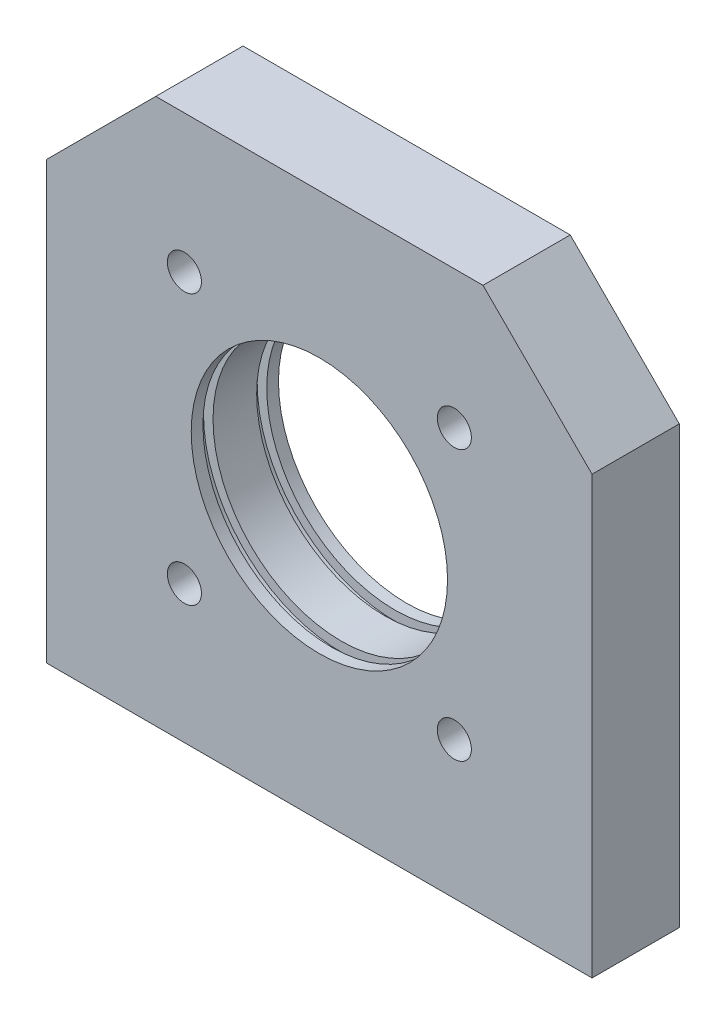
ISO-10303-21;
HEADER;
FILE_DESCRIPTION(('STEP AP214'),'2;1');
FILE_NAME('part.step','',(''),(''),'','','');
FILE_SCHEMA(('AUTOMOTIVE_DESIGN { 1 0 10303 214 1 1 1 1 }'));
ENDSEC;
DATA;
#1=APPLICATION_CONTEXT('core data for automotive mechanical design processes');
#2=APPLICATION_PROTOCOL_DEFINITION('international standard','automotive_design',2000,#1);
#3=PRODUCT_CONTEXT('',#1,'mechanical');
#4=PRODUCT('Part','Part','',(#3));
#5=PRODUCT_RELATED_PRODUCT_CATEGORY('part','',(#4));
#6=PRODUCT_DEFINITION_FORMATION('','',#4);
#7=PRODUCT_DEFINITION_CONTEXT('part definition',#1,'design');
#8=PRODUCT_DEFINITION('design','',#6,#7);
#9=PRODUCT_DEFINITION_SHAPE('','',#8);
#10=(LENGTH_UNIT() NAMED_UNIT(*) SI_UNIT(.MILLI.,.METRE.));
#11=(NAMED_UNIT(*) PLANE_ANGLE_UNIT() SI_UNIT($,.RADIAN.));
#12=(NAMED_UNIT(*) SI_UNIT($,.STERADIAN.) SOLID_ANGLE_UNIT());
#13=UNCERTAINTY_MEASURE_WITH_UNIT(LENGTH_MEASURE(1.E-05),#10,'distance_accuracy_value','');
#14=(GEOMETRIC_REPRESENTATION_CONTEXT(3) GLOBAL_UNCERTAINTY_ASSIGNED_CONTEXT((#13)) GLOBAL_UNIT_ASSIGNED_CONTEXT((#10,
#11,#12)) REPRESENTATION_CONTEXT('',''));
#15=CARTESIAN_POINT('',(0.,0.,0.));
#16=DIRECTION('',(0.,0.,1.));
#17=DIRECTION('',(1.,0.,0.));
#18=AXIS2_PLACEMENT_3D('',#15,#16,#17);
#19=CARTESIAN_POINT('',(0.,0.,0.));
#20=DIRECTION('',(0.,0.,1.));
#21=DIRECTION('',(1.,0.,0.));
#22=AXIS2_PLACEMENT_3D('',#19,#20,#21);
#23=CYLINDRICAL_SURFACE('',#22,23.5);
#24=CARTESIAN_POINT('',(0.,0.,2.15));
#25=DIRECTION('',(0.,0.,-1.));
#26=DIRECTION('',(-1.,0.,0.));
#27=AXIS2_PLACEMENT_3D('',#24,#25,#26);
#28=CIRCLE('',#27,23.5);
#29=CARTESIAN_POINT('',(-23.5,0.,2.15));
#30=VERTEX_POINT('',#29);
#31=EDGE_CURVE('E149',#30,#30,#28,.T.);
#32=ORIENTED_EDGE('',*,*,#31,.F.);
#33=EDGE_LOOP('',(#32));
#34=FACE_BOUND('',#33,.T.);
#35=CARTESIAN_POINT('',(0.,0.,0.));
#36=DIRECTION('',(0.,0.,1.));
#37=DIRECTION('',(1.,0.,0.));
#38=AXIS2_PLACEMENT_3D('',#35,#36,#37);
#39=CIRCLE('',#38,23.5);
#40=CARTESIAN_POINT('',(23.5,0.,0.));
#41=VERTEX_POINT('',#40);
#42=EDGE_CURVE('E161',#41,#41,#39,.T.);
#43=ORIENTED_EDGE('',*,*,#42,.F.);
#44=EDGE_LOOP('',(#43));
#45=FACE_BOUND('',#44,.T.);
#46=ADVANCED_FACE('F43',(#34,#45),#23,.F.);
#47=CARTESIAN_POINT('',(50.,-50.,16.));
#48=DIRECTION('',(-1.,0.,0.));
#49=DIRECTION('',(0.,0.,1.));
#50=AXIS2_PLACEMENT_3D('',#47,#48,#49);
#51=PLANE('',#50);
#52=DIRECTION('',(0.,1.,0.));
#53=VECTOR('',#52,1.);
#54=CARTESIAN_POINT('',(50.,-50.,0.));
#55=LINE('',#54,#53);
#56=CARTESIAN_POINT('',(50.,-50.,0.));
#57=VERTEX_POINT('',#56);
#58=CARTESIAN_POINT('',(50.,29.9999999999999,0.));
#59=VERTEX_POINT('',#58);
#60=EDGE_CURVE('E183',#57,#59,#55,.T.);
#61=ORIENTED_EDGE('',*,*,#60,.T.);
#62=DIRECTION('',(0.,0.,1.));
#63=VECTOR('',#62,1.);
#64=CARTESIAN_POINT('',(50.,29.9999999999999,16.));
#65=LINE('',#64,#63);
#66=CARTESIAN_POINT('',(50.,29.9999999999999,16.));
#67=VERTEX_POINT('',#66);
#68=EDGE_CURVE('E11',#59,#67,#65,.T.);
#69=ORIENTED_EDGE('',*,*,#68,.T.);
#70=DIRECTION('',(0.,1.,0.));
#71=VECTOR('',#70,1.);
#72=CARTESIAN_POINT('',(50.,-50.,16.));
#73=LINE('',#72,#71);
#74=CARTESIAN_POINT('',(50.,-50.,16.));
#75=VERTEX_POINT('',#74);
#76=EDGE_CURVE('E184',#75,#67,#73,.T.);
#77=ORIENTED_EDGE('',*,*,#76,.F.);
#78=DIRECTION('',(0.,0.,-1.));
#79=VECTOR('',#78,1.);
#80=CARTESIAN_POINT('',(50.,-50.,16.));
#81=LINE('',#80,#79);
#82=EDGE_CURVE('E197',#75,#57,#81,.T.);
#83=ORIENTED_EDGE('',*,*,#82,.T.);
#84=EDGE_LOOP('',(#61,#69,#77,#83));
#85=FACE_BOUND('',#84,.T.);
#86=ADVANCED_FACE('F256',(#85),#51,.F.);
#87=CARTESIAN_POINT('',(-50.,50.,16.));
#88=DIRECTION('',(0.,-1.,0.));
#89=DIRECTION('',(0.,0.,-1.));
#90=AXIS2_PLACEMENT_3D('',#87,#88,#89);
#91=PLANE('',#90);
#92=DIRECTION('',(-1.,0.,0.));
#93=VECTOR('',#92,1.);
#94=CARTESIAN_POINT('',(-50.,50.,0.));
#95=LINE('',#94,#93);
#96=CARTESIAN_POINT('',(30.,50.,0.));
#97=VERTEX_POINT('',#96);
#98=CARTESIAN_POINT('',(-29.9999999999999,50.,0.));
#99=VERTEX_POINT('',#98);
#100=EDGE_CURVE('E200',#97,#99,#95,.T.);
#101=ORIENTED_EDGE('',*,*,#100,.T.);
#102=DIRECTION('',(0.,0.,1.));
#103=VECTOR('',#102,1.);
#104=CARTESIAN_POINT('',(-29.9999999999999,50.,16.));
#105=LINE('',#104,#103);
#106=CARTESIAN_POINT('',(-29.9999999999999,50.,16.));
#107=VERTEX_POINT('',#106);
#108=EDGE_CURVE('E66',#99,#107,#105,.T.);
#109=ORIENTED_EDGE('',*,*,#108,.T.);
#110=DIRECTION('',(-1.,0.,0.));
#111=VECTOR('',#110,1.);
#112=CARTESIAN_POINT('',(-50.,50.,16.));
#113=LINE('',#112,#111);
#114=CARTESIAN_POINT('',(30.,50.,16.));
#115=VERTEX_POINT('',#114);
#116=EDGE_CURVE('E187',#115,#107,#113,.T.);
#117=ORIENTED_EDGE('',*,*,#116,.F.);
#118=DIRECTION('',(0.,0.,-1.));
#119=VECTOR('',#118,1.);
#120=CARTESIAN_POINT('',(30.,50.,16.));
#121=LINE('',#120,#119);
#122=EDGE_CURVE('E225',#115,#97,#121,.T.);
#123=ORIENTED_EDGE('',*,*,#122,.T.);
#124=EDGE_LOOP('',(#101,#109,#117,#123));
#125=FACE_BOUND('',#124,.T.);
#126=ADVANCED_FACE('F251',(#125),#91,.F.);
#127=CARTESIAN_POINT('',(-50.,-50.,16.));
#128=DIRECTION('',(1.,0.,0.));
#129=DIRECTION('',(0.,0.,-1.));
#130=AXIS2_PLACEMENT_3D('',#127,#128,#129);
#131=PLANE('',#130);
#132=DIRECTION('',(0.,-1.,0.));
#133=VECTOR('',#132,1.);
#134=CARTESIAN_POINT('',(-50.,-50.,16.));
#135=LINE('',#134,#133);
#136=CARTESIAN_POINT('',(-50.,30.,16.));
#137=VERTEX_POINT('',#136);
#138=CARTESIAN_POINT('',(-50.,-50.,16.));
#139=VERTEX_POINT('',#138);
#140=EDGE_CURVE('E191',#137,#139,#135,.T.);
#141=ORIENTED_EDGE('',*,*,#140,.F.);
#142=DIRECTION('',(0.,0.,-1.));
#143=VECTOR('',#142,1.);
#144=CARTESIAN_POINT('',(-50.,30.,16.));
#145=LINE('',#144,#143);
#146=CARTESIAN_POINT('',(-50.,30.,0.));
#147=VERTEX_POINT('',#146);
#148=EDGE_CURVE('E215',#137,#147,#145,.T.);
#149=ORIENTED_EDGE('',*,*,#148,.T.);
#150=DIRECTION('',(0.,-1.,0.));
#151=VECTOR('',#150,1.);
#152=CARTESIAN_POINT('',(-50.,-50.,0.));
#153=LINE('',#152,#151);
#154=CARTESIAN_POINT('',(-50.,-50.,0.));
#155=VERTEX_POINT('',#154);
#156=EDGE_CURVE('E203',#147,#155,#153,.T.);
#157=ORIENTED_EDGE('',*,*,#156,.T.);
#158=DIRECTION('',(0.,0.,-1.));
#159=VECTOR('',#158,1.);
#160=CARTESIAN_POINT('',(-50.,-50.,16.));
#161=LINE('',#160,#159);
#162=EDGE_CURVE('E211',#139,#155,#161,.T.);
#163=ORIENTED_EDGE('',*,*,#162,.F.);
#164=EDGE_LOOP('',(#141,#149,#157,#163));
#165=FACE_BOUND('',#164,.T.);
#166=ADVANCED_FACE('F243',(#165),#131,.F.);
#167=CARTESIAN_POINT('',(-50.,-50.,16.));
#168=DIRECTION('',(0.,1.,0.));
#169=DIRECTION('',(0.,0.,1.));
#170=AXIS2_PLACEMENT_3D('',#167,#168,#169);
#171=PLANE('',#170);
#172=CARTESIAN_POINT('',(40.,-50.,8.));
#173=DIRECTION('',(0.,-1.,0.));
#174=DIRECTION('',(0.,0.,-1.));
#175=AXIS2_PLACEMENT_3D('',#172,#173,#174);
#176=CIRCLE('',#175,3.12499999999999);
#177=CARTESIAN_POINT('',(40.,-50.,4.87500000000001));
#178=VERTEX_POINT('',#177);
#179=EDGE_CURVE('E119',#178,#178,#176,.T.);
#180=ORIENTED_EDGE('',*,*,#179,.F.);
#181=EDGE_LOOP('',(#180));
#182=FACE_BOUND('',#181,.T.);
#183=CARTESIAN_POINT('',(0.,-50.,8.));
#184=DIRECTION('',(0.,-1.,0.));
#185=DIRECTION('',(0.,0.,-1.));
#186=AXIS2_PLACEMENT_3D('',#183,#184,#185);
#187=CIRCLE('',#186,3.12499999999999);
#188=CARTESIAN_POINT('',(0.,-50.,4.87500000000001));
#189=VERTEX_POINT('',#188);
#190=EDGE_CURVE('E118',#189,#189,#187,.T.);
#191=ORIENTED_EDGE('',*,*,#190,.F.);
#192=EDGE_LOOP('',(#191));
#193=FACE_BOUND('',#192,.T.);
#194=CARTESIAN_POINT('',(-40.,-50.,8.));
#195=DIRECTION('',(0.,-1.,0.));
#196=DIRECTION('',(0.,0.,-1.));
#197=AXIS2_PLACEMENT_3D('',#194,#195,#196);
#198=CIRCLE('',#197,3.12499999999999);
#199=CARTESIAN_POINT('',(-40.,-50.,4.87500000000001));
#200=VERTEX_POINT('',#199);
#201=EDGE_CURVE('E135',#200,#200,#198,.T.);
#202=ORIENTED_EDGE('',*,*,#201,.F.);
#203=EDGE_LOOP('',(#202));
#204=FACE_BOUND('',#203,.T.);
#205=DIRECTION('',(1.,0.,0.));
#206=VECTOR('',#205,1.);
#207=CARTESIAN_POINT('',(-50.,-50.,0.));
#208=LINE('',#207,#206);
#209=EDGE_CURVE('E188',#155,#57,#208,.T.);
#210=ORIENTED_EDGE('',*,*,#209,.T.);
#211=ORIENTED_EDGE('',*,*,#82,.F.);
#212=DIRECTION('',(1.,0.,0.));
#213=VECTOR('',#212,1.);
#214=CARTESIAN_POINT('',(-50.,-50.,16.));
#215=LINE('',#214,#213);
#216=EDGE_CURVE('E194',#139,#75,#215,.T.);
#217=ORIENTED_EDGE('',*,*,#216,.F.);
#218=ORIENTED_EDGE('',*,*,#162,.T.);
#219=EDGE_LOOP('',(#210,#211,#217,#218));
#220=FACE_BOUND('',#219,.T.);
#221=ADVANCED_FACE('F259',(#182,#193,#204,#220),#171,.F.);
#222=CARTESIAN_POINT('',(0.,0.,16.));
#223=DIRECTION('',(0.,0.,-1.));
#224=DIRECTION('',(-1.,0.,0.));
#225=AXIS2_PLACEMENT_3D('',#222,#223,#224);
#226=PLANE('',#225);
#227=CARTESIAN_POINT('',(24.748737341529,24.7487373415293,16.));
#228=DIRECTION('',(0.,0.,-1.));
#229=DIRECTION('',(-1.,0.,0.));
#230=AXIS2_PLACEMENT_3D('',#227,#228,#229);
#231=CIRCLE('',#230,3.125);
#232=CARTESIAN_POINT('',(21.623737341529,24.7487373415293,16.));
#233=VERTEX_POINT('',#232);
#234=EDGE_CURVE('E363',#233,#233,#231,.T.);
#235=ORIENTED_EDGE('',*,*,#234,.T.);
#236=EDGE_LOOP('',(#235));
#237=FACE_BOUND('',#236,.T.);
#238=CARTESIAN_POINT('',(-24.7487373415307,24.7487373415304,16.));
#239=DIRECTION('',(0.,0.,-1.));
#240=DIRECTION('',(-1.,0.,0.));
#241=AXIS2_PLACEMENT_3D('',#238,#239,#240);
#242=CIRCLE('',#241,3.125);
#243=CARTESIAN_POINT('',(-27.8737373415307,24.7487373415304,16.));
#244=VERTEX_POINT('',#243);
#245=EDGE_CURVE('E378',#244,#244,#242,.T.);
#246=ORIENTED_EDGE('',*,*,#245,.T.);
#247=EDGE_LOOP('',(#246));
#248=FACE_BOUND('',#247,.T.);
#249=CARTESIAN_POINT('',(-24.7487373415318,-24.7487373415293,16.));
#250=DIRECTION('',(0.,0.,-1.));
#251=DIRECTION('',(-1.,0.,0.));
#252=AXIS2_PLACEMENT_3D('',#249,#250,#251);
#253=CIRCLE('',#252,3.125);
#254=CARTESIAN_POINT('',(-27.8737373415318,-24.7487373415293,16.));
#255=VERTEX_POINT('',#254);
#256=EDGE_CURVE('E386',#255,#255,#253,.T.);
#257=ORIENTED_EDGE('',*,*,#256,.T.);
#258=EDGE_LOOP('',(#257));
#259=FACE_BOUND('',#258,.T.);
#260=CARTESIAN_POINT('',(24.7487373415279,-24.7487373415304,16.));
#261=DIRECTION('',(0.,0.,-1.));
#262=DIRECTION('',(-1.,0.,0.));
#263=AXIS2_PLACEMENT_3D('',#260,#261,#262);
#264=CIRCLE('',#263,3.125);
#265=CARTESIAN_POINT('',(21.6237373415279,-24.7487373415304,16.));
#266=VERTEX_POINT('',#265);
#267=EDGE_CURVE('E128',#266,#266,#264,.T.);
#268=ORIENTED_EDGE('',*,*,#267,.T.);
#269=EDGE_LOOP('',(#268));
#270=FACE_BOUND('',#269,.T.);
#271=CARTESIAN_POINT('',(0.,0.,16.));
#272=DIRECTION('',(0.,0.,-1.));
#273=DIRECTION('',(-1.,0.,0.));
#274=AXIS2_PLACEMENT_3D('',#271,#272,#273);
#275=CIRCLE('',#274,23.5);
#276=CARTESIAN_POINT('',(-23.5,0.,16.));
#277=VERTEX_POINT('',#276);
#278=EDGE_CURVE('E179',#277,#277,#275,.T.);
#279=ORIENTED_EDGE('',*,*,#278,.T.);
#280=EDGE_LOOP('',(#279));
#281=FACE_BOUND('',#280,.T.);
#282=ORIENTED_EDGE('',*,*,#116,.T.);
#283=DIRECTION('',(0.707106781186549,0.707106781186546,0.));
#284=VECTOR('',#283,1.);
#285=CARTESIAN_POINT('',(-50.,30.,16.));
#286=LINE('',#285,#284);
#287=EDGE_CURVE('E53',#107,#137,#286,.F.);
#288=ORIENTED_EDGE('',*,*,#287,.T.);
#289=ORIENTED_EDGE('',*,*,#140,.T.);
#290=ORIENTED_EDGE('',*,*,#216,.T.);
#291=ORIENTED_EDGE('',*,*,#76,.T.);
#292=DIRECTION('',(0.707106781186546,-0.707106781186549,0.));
#293=VECTOR('',#292,1.);
#294=CARTESIAN_POINT('',(30.,50.,16.));
#295=LINE('',#294,#293);
#296=EDGE_CURVE('E231',#67,#115,#295,.F.);
#297=ORIENTED_EDGE('',*,*,#296,.T.);
#298=EDGE_LOOP('',(#282,#288,#289,#290,#291,#297));
#299=FACE_BOUND('',#298,.T.);
#300=ADVANCED_FACE('F238',(#237,#248,#259,#270,#281,#299),#226,.F.);
#301=CARTESIAN_POINT('',(0.,0.,0.));
#302=DIRECTION('',(0.,0.,-1.));
#303=DIRECTION('',(-1.,0.,0.));
#304=AXIS2_PLACEMENT_3D('',#301,#302,#303);
#305=PLANE('',#304);
#306=CARTESIAN_POINT('',(24.748737341529,24.7487373415293,0.));
#307=DIRECTION('',(0.,0.,-1.));
#308=DIRECTION('',(-1.,0.,0.));
#309=AXIS2_PLACEMENT_3D('',#306,#307,#308);
#310=CIRCLE('',#309,3.12499999999999);
#311=CARTESIAN_POINT('',(21.623737341529,24.7487373415293,0.));
#312=VERTEX_POINT('',#311);
#313=EDGE_CURVE('E366',#312,#312,#310,.T.);
#314=ORIENTED_EDGE('',*,*,#313,.F.);
#315=EDGE_LOOP('',(#314));
#316=FACE_BOUND('',#315,.T.);
#317=CARTESIAN_POINT('',(-24.7487373415307,24.7487373415304,0.));
#318=DIRECTION('',(0.,0.,-1.));
#319=DIRECTION('',(-1.,0.,0.));
#320=AXIS2_PLACEMENT_3D('',#317,#318,#319);
#321=CIRCLE('',#320,3.12499999999999);
#322=CARTESIAN_POINT('',(-27.8737373415307,24.7487373415304,0.));
#323=VERTEX_POINT('',#322);
#324=EDGE_CURVE('E372',#323,#323,#321,.T.);
#325=ORIENTED_EDGE('',*,*,#324,.F.);
#326=EDGE_LOOP('',(#325));
#327=FACE_BOUND('',#326,.T.);
#328=CARTESIAN_POINT('',(-24.7487373415318,-24.7487373415293,0.));
#329=DIRECTION('',(0.,0.,-1.));
#330=DIRECTION('',(-1.,0.,0.));
#331=AXIS2_PLACEMENT_3D('',#328,#329,#330);
#332=CIRCLE('',#331,3.12499999999999);
#333=CARTESIAN_POINT('',(-27.8737373415318,-24.7487373415293,0.));
#334=VERTEX_POINT('',#333);
#335=EDGE_CURVE('E382',#334,#334,#332,.T.);
#336=ORIENTED_EDGE('',*,*,#335,.F.);
#337=EDGE_LOOP('',(#336));
#338=FACE_BOUND('',#337,.T.);
#339=CARTESIAN_POINT('',(24.7487373415279,-24.7487373415304,0.));
#340=DIRECTION('',(0.,0.,-1.));
#341=DIRECTION('',(-1.,0.,0.));
#342=AXIS2_PLACEMENT_3D('',#339,#340,#341);
#343=CIRCLE('',#342,3.12499999999999);
#344=CARTESIAN_POINT('',(21.6237373415279,-24.7487373415304,0.));
#345=VERTEX_POINT('',#344);
#346=EDGE_CURVE('E390',#345,#345,#343,.T.);
#347=ORIENTED_EDGE('',*,*,#346,.F.);
#348=EDGE_LOOP('',(#347));
#349=FACE_BOUND('',#348,.T.);
#350=ORIENTED_EDGE('',*,*,#42,.T.);
#351=EDGE_LOOP('',(#350));
#352=FACE_BOUND('',#351,.T.);
#353=ORIENTED_EDGE('',*,*,#156,.F.);
#354=DIRECTION('',(-0.707106781186549,-0.707106781186546,0.));
#355=VECTOR('',#354,1.);
#356=CARTESIAN_POINT('',(-39.9999999999999,40.,0.));
#357=LINE('',#356,#355);
#358=EDGE_CURVE('E222',#147,#99,#357,.F.);
#359=ORIENTED_EDGE('',*,*,#358,.T.);
#360=ORIENTED_EDGE('',*,*,#100,.F.);
#361=DIRECTION('',(-0.707106781186546,0.707106781186549,0.));
#362=VECTOR('',#361,1.);
#363=CARTESIAN_POINT('',(40.,39.9999999999999,0.));
#364=LINE('',#363,#362);
#365=EDGE_CURVE('E219',#97,#59,#364,.F.);
#366=ORIENTED_EDGE('',*,*,#365,.T.);
#367=ORIENTED_EDGE('',*,*,#60,.F.);
#368=ORIENTED_EDGE('',*,*,#209,.F.);
#369=EDGE_LOOP('',(#353,#359,#360,#366,#367,#368));
#370=FACE_BOUND('',#369,.T.);
#371=ADVANCED_FACE('F249',(#316,#327,#338,#349,#352,#370),#305,.T.);
#372=CARTESIAN_POINT('',(0.,0.,13.85));
#373=DIRECTION('',(0.,0.,-1.));
#374=DIRECTION('',(-1.,0.,0.));
#375=AXIS2_PLACEMENT_3D('',#372,#373,#374);
#376=CIRCLE('',#375,23.5);
#377=CARTESIAN_POINT('',(-23.5,0.,13.85));
#378=VERTEX_POINT('',#377);
#379=EDGE_CURVE('E144',#378,#378,#376,.T.);
#380=ORIENTED_EDGE('',*,*,#379,.T.);
#381=EDGE_LOOP('',(#380));
#382=FACE_BOUND('',#381,.T.);
#383=ORIENTED_EDGE('',*,*,#278,.F.);
#384=EDGE_LOOP('',(#383));
#385=FACE_BOUND('',#384,.T.);
#386=ADVANCED_FACE('F276',(#382,#385),#23,.F.);
#387=CARTESIAN_POINT('',(0.,0.,2.15));
#388=DIRECTION('',(0.,0.,-1.));
#389=DIRECTION('',(-1.,0.,0.));
#390=AXIS2_PLACEMENT_3D('',#387,#388,#389);
#391=PLANE('',#390);
#392=CARTESIAN_POINT('',(0.,0.,2.15));
#393=DIRECTION('',(0.,0.,-1.));
#394=DIRECTION('',(-1.,0.,0.));
#395=AXIS2_PLACEMENT_3D('',#392,#393,#394);
#396=CIRCLE('',#395,25.25);
#397=CARTESIAN_POINT('',(-25.25,0.,2.15));
#398=VERTEX_POINT('',#397);
#399=EDGE_CURVE('E169',#398,#398,#396,.T.);
#400=ORIENTED_EDGE('',*,*,#399,.F.);
#401=EDGE_LOOP('',(#400));
#402=FACE_BOUND('',#401,.T.);
#403=ORIENTED_EDGE('',*,*,#31,.T.);
#404=EDGE_LOOP('',(#403));
#405=FACE_BOUND('',#404,.T.);
#406=ADVANCED_FACE('F286',(#402,#405),#391,.F.);
#407=CARTESIAN_POINT('',(0.,0.,0.));
#408=DIRECTION('',(0.,0.,-1.));
#409=DIRECTION('',(-1.,0.,0.));
#410=AXIS2_PLACEMENT_3D('',#407,#408,#409);
#411=CYLINDRICAL_SURFACE('',#410,25.25);
#412=CARTESIAN_POINT('',(0.,0.,4.));
#413=DIRECTION('',(0.,0.,-1.));
#414=DIRECTION('',(-1.,0.,0.));
#415=AXIS2_PLACEMENT_3D('',#412,#413,#414);
#416=CIRCLE('',#415,25.25);
#417=CARTESIAN_POINT('',(-25.25,0.,4.));
#418=VERTEX_POINT('',#417);
#419=EDGE_CURVE('E165',#418,#418,#416,.T.);
#420=ORIENTED_EDGE('',*,*,#419,.F.);
#421=EDGE_LOOP('',(#420));
#422=FACE_BOUND('',#421,.T.);
#423=ORIENTED_EDGE('',*,*,#399,.T.);
#424=EDGE_LOOP('',(#423));
#425=FACE_BOUND('',#424,.T.);
#426=ADVANCED_FACE('F310',(#422,#425),#411,.F.);
#427=CARTESIAN_POINT('',(0.,0.,4.));
#428=DIRECTION('',(0.,0.,1.));
#429=DIRECTION('',(1.,0.,0.));
#430=AXIS2_PLACEMENT_3D('',#427,#428,#429);
#431=PLANE('',#430);
#432=CARTESIAN_POINT('',(0.,0.,4.));
#433=DIRECTION('',(0.,0.,-1.));
#434=DIRECTION('',(-1.,0.,0.));
#435=AXIS2_PLACEMENT_3D('',#432,#433,#434);
#436=CIRCLE('',#435,23.5);
#437=CARTESIAN_POINT('',(-23.5,0.,4.));
#438=VERTEX_POINT('',#437);
#439=EDGE_CURVE('E143',#438,#438,#436,.T.);
#440=ORIENTED_EDGE('',*,*,#439,.F.);
#441=EDGE_LOOP('',(#440));
#442=FACE_BOUND('',#441,.T.);
#443=ORIENTED_EDGE('',*,*,#419,.T.);
#444=EDGE_LOOP('',(#443));
#445=FACE_BOUND('',#444,.T.);
#446=ADVANCED_FACE('F306',(#442,#445),#431,.F.);
#447=CARTESIAN_POINT('',(0.,0.,12.));
#448=DIRECTION('',(0.,0.,-1.));
#449=DIRECTION('',(-1.,0.,0.));
#450=AXIS2_PLACEMENT_3D('',#447,#448,#449);
#451=PLANE('',#450);
#452=CARTESIAN_POINT('',(0.,0.,12.));
#453=DIRECTION('',(0.,0.,-1.));
#454=DIRECTION('',(-1.,0.,0.));
#455=AXIS2_PLACEMENT_3D('',#452,#453,#454);
#456=CIRCLE('',#455,25.25);
#457=CARTESIAN_POINT('',(-25.25,0.,12.));
#458=VERTEX_POINT('',#457);
#459=EDGE_CURVE('E153',#458,#458,#456,.T.);
#460=ORIENTED_EDGE('',*,*,#459,.F.);
#461=EDGE_LOOP('',(#460));
#462=FACE_BOUND('',#461,.T.);
#463=CARTESIAN_POINT('',(0.,0.,12.));
#464=DIRECTION('',(0.,0.,-1.));
#465=DIRECTION('',(-1.,0.,0.));
#466=AXIS2_PLACEMENT_3D('',#463,#464,#465);
#467=CIRCLE('',#466,23.5);
#468=CARTESIAN_POINT('',(-23.5,0.,12.));
#469=VERTEX_POINT('',#468);
#470=EDGE_CURVE('E157',#469,#469,#467,.T.);
#471=ORIENTED_EDGE('',*,*,#470,.T.);
#472=EDGE_LOOP('',(#471));
#473=FACE_BOUND('',#472,.T.);
#474=ADVANCED_FACE('F309',(#462,#473),#451,.F.);
#475=CARTESIAN_POINT('',(0.,0.,0.));
#476=DIRECTION('',(0.,0.,-1.));
#477=DIRECTION('',(-1.,0.,0.));
#478=AXIS2_PLACEMENT_3D('',#475,#476,#477);
#479=CYLINDRICAL_SURFACE('',#478,25.25);
#480=CARTESIAN_POINT('',(0.,0.,13.85));
#481=DIRECTION('',(0.,0.,-1.));
#482=DIRECTION('',(-1.,0.,0.));
#483=AXIS2_PLACEMENT_3D('',#480,#481,#482);
#484=CIRCLE('',#483,25.25);
#485=CARTESIAN_POINT('',(-25.25,0.,13.85));
#486=VERTEX_POINT('',#485);
#487=EDGE_CURVE('E148',#486,#486,#484,.T.);
#488=ORIENTED_EDGE('',*,*,#487,.F.);
#489=EDGE_LOOP('',(#488));
#490=FACE_BOUND('',#489,.T.);
#491=ORIENTED_EDGE('',*,*,#459,.T.);
#492=EDGE_LOOP('',(#491));
#493=FACE_BOUND('',#492,.T.);
#494=ADVANCED_FACE('F299',(#490,#493),#479,.F.);
#495=CARTESIAN_POINT('',(0.,0.,13.85));
#496=DIRECTION('',(0.,0.,1.));
#497=DIRECTION('',(1.,0.,0.));
#498=AXIS2_PLACEMENT_3D('',#495,#496,#497);
#499=PLANE('',#498);
#500=ORIENTED_EDGE('',*,*,#379,.F.);
#501=EDGE_LOOP('',(#500));
#502=FACE_BOUND('',#501,.T.);
#503=ORIENTED_EDGE('',*,*,#487,.T.);
#504=EDGE_LOOP('',(#503));
#505=FACE_BOUND('',#504,.T.);
#506=ADVANCED_FACE('F290',(#502,#505),#499,.F.);
#507=ORIENTED_EDGE('',*,*,#470,.F.);
#508=EDGE_LOOP('',(#507));
#509=FACE_BOUND('',#508,.T.);
#510=ORIENTED_EDGE('',*,*,#439,.T.);
#511=EDGE_LOOP('',(#510));
#512=FACE_BOUND('',#511,.T.);
#513=ADVANCED_FACE('F277',(#509,#512),#23,.F.);
#514=CARTESIAN_POINT('',(-40.,-35.,8.));
#515=DIRECTION('',(0.,-1.,0.));
#516=DIRECTION('',(0.,0.,-1.));
#517=AXIS2_PLACEMENT_3D('',#514,#515,#516);
#518=CONICAL_SURFACE('',#517,3.12499999999999,1.02974425867665);
#519=CARTESIAN_POINT('',(-40.,-33.1223105655389,8.));
#520=VERTEX_POINT('',#519);
#521=VERTEX_LOOP('',#520);
#522=FACE_BOUND('',#521,.T.);
#523=CARTESIAN_POINT('',(-40.,-35.,8.));
#524=DIRECTION('',(0.,-1.,0.));
#525=DIRECTION('',(0.,0.,-1.));
#526=AXIS2_PLACEMENT_3D('',#523,#524,#525);
#527=CIRCLE('',#526,3.12499999999999);
#528=CARTESIAN_POINT('',(-40.,-35.,4.87500000000001));
#529=VERTEX_POINT('',#528);
#530=EDGE_CURVE('E139',#529,#529,#527,.T.);
#531=ORIENTED_EDGE('',*,*,#530,.T.);
#532=EDGE_LOOP('',(#531));
#533=FACE_BOUND('',#532,.T.);
#534=ADVANCED_FACE('F289',(#522,#533),#518,.F.);
#535=CARTESIAN_POINT('',(-40.,-50.,8.));
#536=DIRECTION('',(0.,-1.,0.));
#537=DIRECTION('',(0.,0.,-1.));
#538=AXIS2_PLACEMENT_3D('',#535,#536,#537);
#539=CYLINDRICAL_SURFACE('',#538,3.12499999999999);
#540=ORIENTED_EDGE('',*,*,#530,.F.);
#541=EDGE_LOOP('',(#540));
#542=FACE_BOUND('',#541,.T.);
#543=ORIENTED_EDGE('',*,*,#201,.T.);
#544=EDGE_LOOP('',(#543));
#545=FACE_BOUND('',#544,.T.);
#546=ADVANCED_FACE('F296',(#542,#545),#539,.F.);
#547=CARTESIAN_POINT('',(0.,-35.,8.));
#548=DIRECTION('',(0.,-1.,0.));
#549=DIRECTION('',(0.,0.,-1.));
#550=AXIS2_PLACEMENT_3D('',#547,#548,#549);
#551=CONICAL_SURFACE('',#550,3.12499999999999,1.02974425867665);
#552=CARTESIAN_POINT('',(0.,-33.1223105655389,8.));
#553=VERTEX_POINT('',#552);
#554=VERTEX_LOOP('',#553);
#555=FACE_BOUND('',#554,.T.);
#556=CARTESIAN_POINT('',(0.,-35.,8.));
#557=DIRECTION('',(0.,-1.,0.));
#558=DIRECTION('',(0.,0.,-1.));
#559=AXIS2_PLACEMENT_3D('',#556,#557,#558);
#560=CIRCLE('',#559,3.12499999999999);
#561=CARTESIAN_POINT('',(0.,-35.,4.87500000000001));
#562=VERTEX_POINT('',#561);
#563=EDGE_CURVE('E125',#562,#562,#560,.T.);
#564=ORIENTED_EDGE('',*,*,#563,.T.);
#565=EDGE_LOOP('',(#564));
#566=FACE_BOUND('',#565,.T.);
#567=ADVANCED_FACE('F332',(#555,#566),#551,.F.);
#568=CARTESIAN_POINT('',(0.,-50.,8.));
#569=DIRECTION('',(0.,-1.,0.));
#570=DIRECTION('',(0.,0.,-1.));
#571=AXIS2_PLACEMENT_3D('',#568,#569,#570);
#572=CYLINDRICAL_SURFACE('',#571,3.12499999999999);
#573=ORIENTED_EDGE('',*,*,#563,.F.);
#574=EDGE_LOOP('',(#573));
#575=FACE_BOUND('',#574,.T.);
#576=ORIENTED_EDGE('',*,*,#190,.T.);
#577=EDGE_LOOP('',(#576));
#578=FACE_BOUND('',#577,.T.);
#579=ADVANCED_FACE('F111',(#575,#578),#572,.F.);
#580=CARTESIAN_POINT('',(40.,-35.,8.));
#581=DIRECTION('',(0.,-1.,0.));
#582=DIRECTION('',(0.,0.,-1.));
#583=AXIS2_PLACEMENT_3D('',#580,#581,#582);
#584=CONICAL_SURFACE('',#583,3.12499999999999,1.02974425867665);
#585=CARTESIAN_POINT('',(40.,-33.1223105655389,8.));
#586=VERTEX_POINT('',#585);
#587=VERTEX_LOOP('',#586);
#588=FACE_BOUND('',#587,.T.);
#589=CARTESIAN_POINT('',(40.,-35.,8.));
#590=DIRECTION('',(0.,-1.,0.));
#591=DIRECTION('',(0.,0.,-1.));
#592=AXIS2_PLACEMENT_3D('',#589,#590,#591);
#593=CIRCLE('',#592,3.12499999999999);
#594=CARTESIAN_POINT('',(40.,-35.,4.87500000000001));
#595=VERTEX_POINT('',#594);
#596=EDGE_CURVE('E115',#595,#595,#593,.T.);
#597=ORIENTED_EDGE('',*,*,#596,.T.);
#598=EDGE_LOOP('',(#597));
#599=FACE_BOUND('',#598,.T.);
#600=ADVANCED_FACE('F107',(#588,#599),#584,.F.);
#601=CARTESIAN_POINT('',(40.,-50.,8.));
#602=DIRECTION('',(0.,-1.,0.));
#603=DIRECTION('',(0.,0.,-1.));
#604=AXIS2_PLACEMENT_3D('',#601,#602,#603);
#605=CYLINDRICAL_SURFACE('',#604,3.12499999999999);
#606=ORIENTED_EDGE('',*,*,#596,.F.);
#607=EDGE_LOOP('',(#606));
#608=FACE_BOUND('',#607,.T.);
#609=ORIENTED_EDGE('',*,*,#179,.T.);
#610=EDGE_LOOP('',(#609));
#611=FACE_BOUND('',#610,.T.);
#612=ADVANCED_FACE('F110',(#608,#611),#605,.F.);
#613=CARTESIAN_POINT('',(24.7487373415279,-24.7487373415304,0.));
#614=DIRECTION('',(0.,0.,-1.));
#615=DIRECTION('',(-1.,0.,0.));
#616=AXIS2_PLACEMENT_3D('',#613,#614,#615);
#617=CYLINDRICAL_SURFACE('',#616,3.12499999999999);
#618=ORIENTED_EDGE('',*,*,#267,.F.);
#619=EDGE_LOOP('',(#618));
#620=FACE_BOUND('',#619,.T.);
#621=ORIENTED_EDGE('',*,*,#346,.T.);
#622=EDGE_LOOP('',(#621));
#623=FACE_BOUND('',#622,.T.);
#624=ADVANCED_FACE('F342',(#620,#623),#617,.F.);
#625=CARTESIAN_POINT('',(-24.7487373415318,-24.7487373415293,0.));
#626=DIRECTION('',(0.,0.,-1.));
#627=DIRECTION('',(-1.,0.,0.));
#628=AXIS2_PLACEMENT_3D('',#625,#626,#627);
#629=CYLINDRICAL_SURFACE('',#628,3.12499999999999);
#630=ORIENTED_EDGE('',*,*,#256,.F.);
#631=EDGE_LOOP('',(#630));
#632=FACE_BOUND('',#631,.T.);
#633=ORIENTED_EDGE('',*,*,#335,.T.);
#634=EDGE_LOOP('',(#633));
#635=FACE_BOUND('',#634,.T.);
#636=ADVANCED_FACE('F345',(#632,#635),#629,.F.);
#637=CARTESIAN_POINT('',(-24.7487373415307,24.7487373415304,0.));
#638=DIRECTION('',(0.,0.,-1.));
#639=DIRECTION('',(-1.,0.,0.));
#640=AXIS2_PLACEMENT_3D('',#637,#638,#639);
#641=CYLINDRICAL_SURFACE('',#640,3.12499999999999);
#642=ORIENTED_EDGE('',*,*,#245,.F.);
#643=EDGE_LOOP('',(#642));
#644=FACE_BOUND('',#643,.T.);
#645=ORIENTED_EDGE('',*,*,#324,.T.);
#646=EDGE_LOOP('',(#645));
#647=FACE_BOUND('',#646,.T.);
#648=ADVANCED_FACE('F349',(#644,#647),#641,.F.);
#649=CARTESIAN_POINT('',(24.748737341529,24.7487373415293,0.));
#650=DIRECTION('',(0.,0.,-1.));
#651=DIRECTION('',(-1.,0.,0.));
#652=AXIS2_PLACEMENT_3D('',#649,#650,#651);
#653=CYLINDRICAL_SURFACE('',#652,3.12499999999999);
#654=ORIENTED_EDGE('',*,*,#234,.F.);
#655=EDGE_LOOP('',(#654));
#656=FACE_BOUND('',#655,.T.);
#657=ORIENTED_EDGE('',*,*,#313,.T.);
#658=EDGE_LOOP('',(#657));
#659=FACE_BOUND('',#658,.T.);
#660=ADVANCED_FACE('F353',(#656,#659),#653,.F.);
#661=CARTESIAN_POINT('',(-50.,30.,16.));
#662=DIRECTION('',(0.707106781186546,-0.707106781186549,0.));
#663=DIRECTION('',(0.,0.,-1.));
#664=AXIS2_PLACEMENT_3D('',#661,#662,#663);
#665=PLANE('',#664);
#666=ORIENTED_EDGE('',*,*,#287,.F.);
#667=ORIENTED_EDGE('',*,*,#108,.F.);
#668=ORIENTED_EDGE('',*,*,#358,.F.);
#669=ORIENTED_EDGE('',*,*,#148,.F.);
#670=EDGE_LOOP('',(#666,#667,#668,#669));
#671=FACE_BOUND('',#670,.T.);
#672=ADVANCED_FACE('F246',(#671),#665,.F.);
#673=CARTESIAN_POINT('',(30.,50.,16.));
#674=DIRECTION('',(-0.707106781186549,-0.707106781186546,0.));
#675=DIRECTION('',(0.,0.,-1.));
#676=AXIS2_PLACEMENT_3D('',#673,#674,#675);
#677=PLANE('',#676);
#678=ORIENTED_EDGE('',*,*,#296,.F.);
#679=ORIENTED_EDGE('',*,*,#68,.F.);
#680=ORIENTED_EDGE('',*,*,#365,.F.);
#681=ORIENTED_EDGE('',*,*,#122,.F.);
#682=EDGE_LOOP('',(#678,#679,#680,#681));
#683=FACE_BOUND('',#682,.T.);
#684=ADVANCED_FACE('F46',(#683),#677,.F.);
#685=CLOSED_SHELL('',(#46,#86,#126,#166,#221,#300,#371,#386,#406,#426,#446,#474,#494,#506,#513,
#534,#546,#567,#579,#600,#612,#624,#636,#648,#660,#672,#684));
#686=MANIFOLD_SOLID_BREP('B2',#685);
#687=ADVANCED_BREP_SHAPE_REPRESENTATION('',(#18,#686),#14);
#688=SHAPE_DEFINITION_REPRESENTATION(#9,#687);
ENDSEC;
END-ISO-10303-21;
